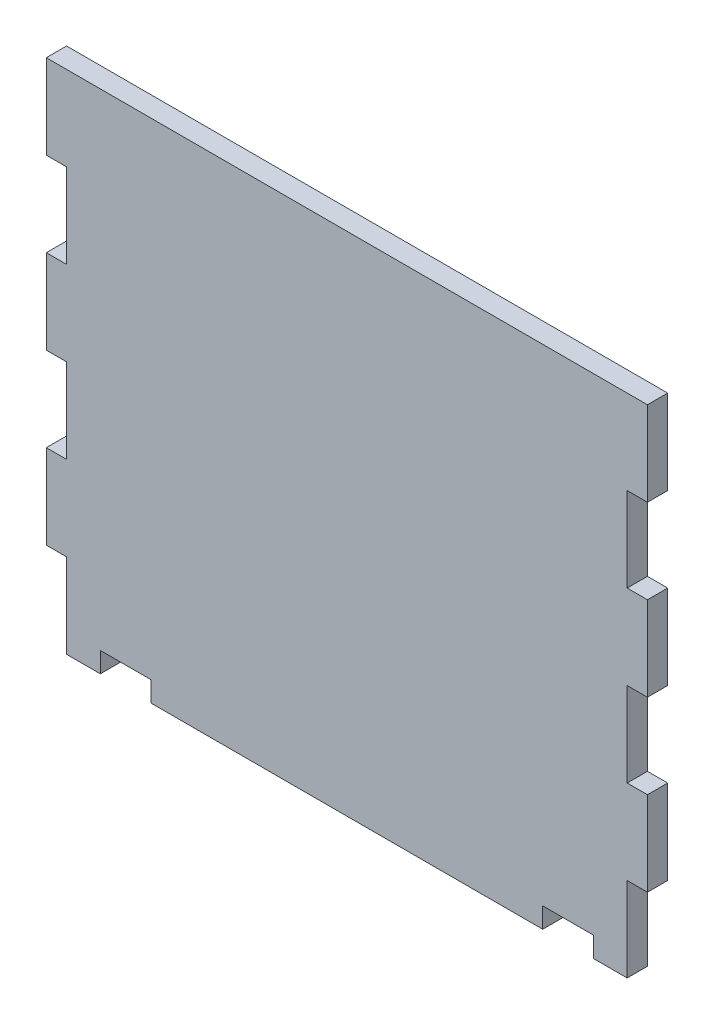
ISO-10303-21;
HEADER;
FILE_DESCRIPTION(('STEP AP214'),'2;1');
FILE_NAME('part.step','',(''),(''),'','','');
FILE_SCHEMA(('AUTOMOTIVE_DESIGN { 1 0 10303 214 1 1 1 1 }'));
ENDSEC;
DATA;
#1=APPLICATION_CONTEXT('core data for automotive mechanical design processes');
#2=APPLICATION_PROTOCOL_DEFINITION('international standard','automotive_design',2000,#1);
#3=PRODUCT_CONTEXT('',#1,'mechanical');
#4=PRODUCT('Part','Part','',(#3));
#5=PRODUCT_RELATED_PRODUCT_CATEGORY('part','',(#4));
#6=PRODUCT_DEFINITION_FORMATION('','',#4);
#7=PRODUCT_DEFINITION_CONTEXT('part definition',#1,'design');
#8=PRODUCT_DEFINITION('design','',#6,#7);
#9=PRODUCT_DEFINITION_SHAPE('','',#8);
#10=(LENGTH_UNIT() NAMED_UNIT(*) SI_UNIT(.MILLI.,.METRE.));
#11=(NAMED_UNIT(*) PLANE_ANGLE_UNIT() SI_UNIT($,.RADIAN.));
#12=(NAMED_UNIT(*) SI_UNIT($,.STERADIAN.) SOLID_ANGLE_UNIT());
#13=UNCERTAINTY_MEASURE_WITH_UNIT(LENGTH_MEASURE(1.E-05),#10,'distance_accuracy_value','');
#14=(GEOMETRIC_REPRESENTATION_CONTEXT(3) GLOBAL_UNCERTAINTY_ASSIGNED_CONTEXT((#13)) GLOBAL_UNIT_ASSIGNED_CONTEXT((#10,
#11,#12)) REPRESENTATION_CONTEXT('',''));
#15=CARTESIAN_POINT('',(0.,0.,0.));
#16=DIRECTION('',(0.,0.,1.));
#17=DIRECTION('',(1.,0.,0.));
#18=AXIS2_PLACEMENT_3D('',#15,#16,#17);
#19=CARTESIAN_POINT('',(0.,0.,6.));
#20=DIRECTION('',(0.,1.,0.));
#21=DIRECTION('',(-1.,0.,0.));
#22=AXIS2_PLACEMENT_3D('',#19,#20,#21);
#23=PLANE('',#22);
#24=DIRECTION('',(1.,0.,0.));
#25=VECTOR('',#24,1.);
#26=CARTESIAN_POINT('',(0.,0.,6.));
#27=LINE('',#26,#25);
#28=CARTESIAN_POINT('',(-16.,0.,6.));
#29=VERTEX_POINT('',#28);
#30=CARTESIAN_POINT('',(-6.00000000000001,0.,6.));
#31=VERTEX_POINT('',#30);
#32=EDGE_CURVE('E542',#29,#31,#27,.T.);
#33=ORIENTED_EDGE('',*,*,#32,.F.);
#34=DIRECTION('',(0.,0.,1.));
#35=VECTOR('',#34,1.);
#36=CARTESIAN_POINT('',(-16.,0.,0.));
#37=LINE('',#36,#35);
#38=CARTESIAN_POINT('',(-16.,0.,0.));
#39=VERTEX_POINT('',#38);
#40=EDGE_CURVE('E291',#39,#29,#37,.T.);
#41=ORIENTED_EDGE('',*,*,#40,.F.);
#42=DIRECTION('',(1.,0.,0.));
#43=VECTOR('',#42,1.);
#44=CARTESIAN_POINT('',(0.,0.,0.));
#45=LINE('',#44,#43);
#46=CARTESIAN_POINT('',(-6.00000000000001,0.,0.));
#47=VERTEX_POINT('',#46);
#48=EDGE_CURVE('E276',#39,#47,#45,.T.);
#49=ORIENTED_EDGE('',*,*,#48,.T.);
#50=DIRECTION('',(0.,0.,1.));
#51=VECTOR('',#50,1.);
#52=CARTESIAN_POINT('',(-6.00000000000001,0.,0.));
#53=LINE('',#52,#51);
#54=EDGE_CURVE('E477',#47,#31,#53,.T.);
#55=ORIENTED_EDGE('',*,*,#54,.T.);
#56=EDGE_LOOP('',(#33,#41,#49,#55));
#57=FACE_BOUND('',#56,.T.);
#58=ADVANCED_FACE('F44',(#57),#23,.F.);
#59=CARTESIAN_POINT('',(-172.,0.,0.));
#60=VERTEX_POINT('',#59);
#61=CARTESIAN_POINT('',(-162.,0.,0.));
#62=VERTEX_POINT('',#61);
#63=EDGE_CURVE('E532',#60,#62,#45,.T.);
#64=ORIENTED_EDGE('',*,*,#63,.T.);
#65=DIRECTION('',(0.,0.,1.));
#66=VECTOR('',#65,1.);
#67=CARTESIAN_POINT('',(-162.,0.,0.));
#68=LINE('',#67,#66);
#69=CARTESIAN_POINT('',(-162.,0.,6.));
#70=VERTEX_POINT('',#69);
#71=EDGE_CURVE('E311',#62,#70,#68,.T.);
#72=ORIENTED_EDGE('',*,*,#71,.T.);
#73=CARTESIAN_POINT('',(-172.,0.,6.));
#74=VERTEX_POINT('',#73);
#75=EDGE_CURVE('E544',#74,#70,#27,.T.);
#76=ORIENTED_EDGE('',*,*,#75,.F.);
#77=DIRECTION('',(0.,0.,1.));
#78=VECTOR('',#77,1.);
#79=CARTESIAN_POINT('',(-172.,0.,0.));
#80=LINE('',#79,#78);
#81=EDGE_CURVE('E453',#60,#74,#80,.T.);
#82=ORIENTED_EDGE('',*,*,#81,.F.);
#83=EDGE_LOOP('',(#64,#72,#76,#82));
#84=FACE_BOUND('',#83,.T.);
#85=ADVANCED_FACE('F644',(#84),#23,.F.);
#86=CARTESIAN_POINT('',(0.,0.,6.));
#87=DIRECTION('',(-1.,0.,0.));
#88=DIRECTION('',(0.,0.,1.));
#89=AXIS2_PLACEMENT_3D('',#86,#87,#88);
#90=PLANE('',#89);
#91=DIRECTION('',(0.,1.,0.));
#92=VECTOR('',#91,1.);
#93=CARTESIAN_POINT('',(0.,0.,6.));
#94=LINE('',#93,#92);
#95=CARTESIAN_POINT('',(0.,125.,6.));
#96=VERTEX_POINT('',#95);
#97=CARTESIAN_POINT('',(0.,150.,6.));
#98=VERTEX_POINT('',#97);
#99=EDGE_CURVE('E528',#96,#98,#94,.T.);
#100=ORIENTED_EDGE('',*,*,#99,.F.);
#101=DIRECTION('',(0.,0.,1.));
#102=VECTOR('',#101,1.);
#103=CARTESIAN_POINT('',(0.,125.,0.));
#104=LINE('',#103,#102);
#105=CARTESIAN_POINT('',(0.,125.,0.));
#106=VERTEX_POINT('',#105);
#107=EDGE_CURVE('E363',#106,#96,#104,.T.);
#108=ORIENTED_EDGE('',*,*,#107,.F.);
#109=DIRECTION('',(0.,1.,0.));
#110=VECTOR('',#109,1.);
#111=CARTESIAN_POINT('',(0.,0.,0.));
#112=LINE('',#111,#110);
#113=CARTESIAN_POINT('',(0.,150.,0.));
#114=VERTEX_POINT('',#113);
#115=EDGE_CURVE('E519',#106,#114,#112,.T.);
#116=ORIENTED_EDGE('',*,*,#115,.T.);
#117=DIRECTION('',(0.,0.,-1.));
#118=VECTOR('',#117,1.);
#119=CARTESIAN_POINT('',(0.,150.,6.));
#120=LINE('',#119,#118);
#121=EDGE_CURVE('E11',#98,#114,#120,.T.);
#122=ORIENTED_EDGE('',*,*,#121,.F.);
#123=EDGE_LOOP('',(#100,#108,#116,#122));
#124=FACE_BOUND('',#123,.T.);
#125=ADVANCED_FACE('F588',(#124),#90,.F.);
#126=CARTESIAN_POINT('',(0.,75.,0.));
#127=VERTEX_POINT('',#126);
#128=CARTESIAN_POINT('',(0.,100.,0.));
#129=VERTEX_POINT('',#128);
#130=EDGE_CURVE('E551',#127,#129,#112,.T.);
#131=ORIENTED_EDGE('',*,*,#130,.T.);
#132=DIRECTION('',(0.,0.,1.));
#133=VECTOR('',#132,1.);
#134=CARTESIAN_POINT('',(0.,100.,0.));
#135=LINE('',#134,#133);
#136=CARTESIAN_POINT('',(0.,100.,6.));
#137=VERTEX_POINT('',#136);
#138=EDGE_CURVE('E366',#129,#137,#135,.T.);
#139=ORIENTED_EDGE('',*,*,#138,.T.);
#140=CARTESIAN_POINT('',(0.,75.,6.));
#141=VERTEX_POINT('',#140);
#142=EDGE_CURVE('E531',#141,#137,#94,.T.);
#143=ORIENTED_EDGE('',*,*,#142,.F.);
#144=DIRECTION('',(0.,0.,1.));
#145=VECTOR('',#144,1.);
#146=CARTESIAN_POINT('',(0.,75.,0.));
#147=LINE('',#146,#145);
#148=EDGE_CURVE('E435',#127,#141,#147,.T.);
#149=ORIENTED_EDGE('',*,*,#148,.F.);
#150=EDGE_LOOP('',(#131,#139,#143,#149));
#151=FACE_BOUND('',#150,.T.);
#152=ADVANCED_FACE('F604',(#151),#90,.F.);
#153=CARTESIAN_POINT('',(-178.,0.,6.));
#154=DIRECTION('',(1.,0.,0.));
#155=DIRECTION('',(0.,0.,-1.));
#156=AXIS2_PLACEMENT_3D('',#153,#154,#155);
#157=PLANE('',#156);
#158=DIRECTION('',(0.,-1.,0.));
#159=VECTOR('',#158,1.);
#160=CARTESIAN_POINT('',(-178.,0.,0.));
#161=LINE('',#160,#159);
#162=CARTESIAN_POINT('',(-178.,100.,0.));
#163=VERTEX_POINT('',#162);
#164=CARTESIAN_POINT('',(-178.,75.,0.));
#165=VERTEX_POINT('',#164);
#166=EDGE_CURVE('E561',#163,#165,#161,.T.);
#167=ORIENTED_EDGE('',*,*,#166,.T.);
#168=DIRECTION('',(0.,0.,1.));
#169=VECTOR('',#168,1.);
#170=CARTESIAN_POINT('',(-178.,75.,0.));
#171=LINE('',#170,#169);
#172=CARTESIAN_POINT('',(-178.,75.,6.));
#173=VERTEX_POINT('',#172);
#174=EDGE_CURVE('E353',#165,#173,#171,.T.);
#175=ORIENTED_EDGE('',*,*,#174,.T.);
#176=DIRECTION('',(0.,-1.,0.));
#177=VECTOR('',#176,1.);
#178=CARTESIAN_POINT('',(-178.,0.,6.));
#179=LINE('',#178,#177);
#180=CARTESIAN_POINT('',(-178.,100.,6.));
#181=VERTEX_POINT('',#180);
#182=EDGE_CURVE('E543',#181,#173,#179,.T.);
#183=ORIENTED_EDGE('',*,*,#182,.F.);
#184=DIRECTION('',(0.,0.,1.));
#185=VECTOR('',#184,1.);
#186=CARTESIAN_POINT('',(-178.,100.,0.));
#187=LINE('',#186,#185);
#188=EDGE_CURVE('E505',#163,#181,#187,.T.);
#189=ORIENTED_EDGE('',*,*,#188,.F.);
#190=EDGE_LOOP('',(#167,#175,#183,#189));
#191=FACE_BOUND('',#190,.T.);
#192=ADVANCED_FACE('F665',(#191),#157,.F.);
#193=CARTESIAN_POINT('',(-178.,150.,0.));
#194=VERTEX_POINT('',#193);
#195=CARTESIAN_POINT('',(-178.,125.,0.));
#196=VERTEX_POINT('',#195);
#197=EDGE_CURVE('E557',#194,#196,#161,.T.);
#198=ORIENTED_EDGE('',*,*,#197,.T.);
#199=DIRECTION('',(0.,0.,1.));
#200=VECTOR('',#199,1.);
#201=CARTESIAN_POINT('',(-178.,125.,0.));
#202=LINE('',#201,#200);
#203=CARTESIAN_POINT('',(-178.,125.,6.));
#204=VERTEX_POINT('',#203);
#205=EDGE_CURVE('E515',#196,#204,#202,.T.);
#206=ORIENTED_EDGE('',*,*,#205,.T.);
#207=CARTESIAN_POINT('',(-178.,150.,6.));
#208=VERTEX_POINT('',#207);
#209=EDGE_CURVE('E538',#208,#204,#179,.T.);
#210=ORIENTED_EDGE('',*,*,#209,.F.);
#211=DIRECTION('',(0.,0.,-1.));
#212=VECTOR('',#211,1.);
#213=CARTESIAN_POINT('',(-178.,150.,6.));
#214=LINE('',#213,#212);
#215=EDGE_CURVE('E53',#208,#194,#214,.T.);
#216=ORIENTED_EDGE('',*,*,#215,.T.);
#217=EDGE_LOOP('',(#198,#206,#210,#216));
#218=FACE_BOUND('',#217,.T.);
#219=ADVANCED_FACE('F571',(#218),#157,.F.);
#220=CARTESIAN_POINT('',(0.,25.,0.));
#221=VERTEX_POINT('',#220);
#222=CARTESIAN_POINT('',(0.,50.,0.));
#223=VERTEX_POINT('',#222);
#224=EDGE_CURVE('E552',#221,#223,#112,.T.);
#225=ORIENTED_EDGE('',*,*,#224,.T.);
#226=DIRECTION('',(0.,0.,1.));
#227=VECTOR('',#226,1.);
#228=CARTESIAN_POINT('',(0.,50.,0.));
#229=LINE('',#228,#227);
#230=CARTESIAN_POINT('',(0.,50.,6.));
#231=VERTEX_POINT('',#230);
#232=EDGE_CURVE('E438',#223,#231,#229,.T.);
#233=ORIENTED_EDGE('',*,*,#232,.T.);
#234=CARTESIAN_POINT('',(0.,25.,6.));
#235=VERTEX_POINT('',#234);
#236=EDGE_CURVE('E533',#235,#231,#94,.T.);
#237=ORIENTED_EDGE('',*,*,#236,.F.);
#238=DIRECTION('',(0.,0.,1.));
#239=VECTOR('',#238,1.);
#240=CARTESIAN_POINT('',(0.,25.,0.));
#241=LINE('',#240,#239);
#242=EDGE_CURVE('E486',#221,#235,#241,.T.);
#243=ORIENTED_EDGE('',*,*,#242,.F.);
#244=EDGE_LOOP('',(#225,#233,#237,#243));
#245=FACE_BOUND('',#244,.T.);
#246=ADVANCED_FACE('F46',(#245),#90,.F.);
#247=CARTESIAN_POINT('',(0.,150.,6.));
#248=DIRECTION('',(0.,-1.,0.));
#249=DIRECTION('',(0.,0.,-1.));
#250=AXIS2_PLACEMENT_3D('',#247,#248,#249);
#251=PLANE('',#250);
#252=DIRECTION('',(-1.,0.,0.));
#253=VECTOR('',#252,1.);
#254=CARTESIAN_POINT('',(0.,150.,0.));
#255=LINE('',#254,#253);
#256=EDGE_CURVE('E553',#114,#194,#255,.T.);
#257=ORIENTED_EDGE('',*,*,#256,.T.);
#258=ORIENTED_EDGE('',*,*,#215,.F.);
#259=DIRECTION('',(-1.,0.,0.));
#260=VECTOR('',#259,1.);
#261=CARTESIAN_POINT('',(0.,150.,6.));
#262=LINE('',#261,#260);
#263=EDGE_CURVE('E534',#98,#208,#262,.T.);
#264=ORIENTED_EDGE('',*,*,#263,.F.);
#265=ORIENTED_EDGE('',*,*,#121,.T.);
#266=EDGE_LOOP('',(#257,#258,#264,#265));
#267=FACE_BOUND('',#266,.T.);
#268=ADVANCED_FACE('F586',(#267),#251,.F.);
#269=CARTESIAN_POINT('',(-178.,50.,6.));
#270=VERTEX_POINT('',#269);
#271=CARTESIAN_POINT('',(-178.,25.,6.));
#272=VERTEX_POINT('',#271);
#273=EDGE_CURVE('E537',#270,#272,#179,.T.);
#274=ORIENTED_EDGE('',*,*,#273,.F.);
#275=DIRECTION('',(0.,0.,1.));
#276=VECTOR('',#275,1.);
#277=CARTESIAN_POINT('',(-178.,50.,0.));
#278=LINE('',#277,#276);
#279=CARTESIAN_POINT('',(-178.,50.,0.));
#280=VERTEX_POINT('',#279);
#281=EDGE_CURVE('E385',#280,#270,#278,.T.);
#282=ORIENTED_EDGE('',*,*,#281,.F.);
#283=CARTESIAN_POINT('',(-178.,25.,0.));
#284=VERTEX_POINT('',#283);
#285=EDGE_CURVE('E556',#280,#284,#161,.T.);
#286=ORIENTED_EDGE('',*,*,#285,.T.);
#287=DIRECTION('',(0.,0.,1.));
#288=VECTOR('',#287,1.);
#289=CARTESIAN_POINT('',(-178.,25.,0.));
#290=LINE('',#289,#288);
#291=EDGE_CURVE('E427',#284,#272,#290,.T.);
#292=ORIENTED_EDGE('',*,*,#291,.T.);
#293=EDGE_LOOP('',(#274,#282,#286,#292));
#294=FACE_BOUND('',#293,.T.);
#295=ADVANCED_FACE('F657',(#294),#157,.F.);
#296=CARTESIAN_POINT('',(-147.,0.,0.));
#297=VERTEX_POINT('',#296);
#298=CARTESIAN_POINT('',(-31.,0.,0.));
#299=VERTEX_POINT('',#298);
#300=EDGE_CURVE('E564',#297,#299,#45,.T.);
#301=ORIENTED_EDGE('',*,*,#300,.T.);
#302=DIRECTION('',(0.,0.,1.));
#303=VECTOR('',#302,1.);
#304=CARTESIAN_POINT('',(-31.,0.,0.));
#305=LINE('',#304,#303);
#306=CARTESIAN_POINT('',(-31.,0.,6.));
#307=VERTEX_POINT('',#306);
#308=EDGE_CURVE('E295',#299,#307,#305,.T.);
#309=ORIENTED_EDGE('',*,*,#308,.T.);
#310=CARTESIAN_POINT('',(-147.,0.,6.));
#311=VERTEX_POINT('',#310);
#312=EDGE_CURVE('E548',#311,#307,#27,.T.);
#313=ORIENTED_EDGE('',*,*,#312,.F.);
#314=DIRECTION('',(0.,0.,1.));
#315=VECTOR('',#314,1.);
#316=CARTESIAN_POINT('',(-147.,0.,0.));
#317=LINE('',#316,#315);
#318=EDGE_CURVE('E301',#297,#311,#317,.T.);
#319=ORIENTED_EDGE('',*,*,#318,.F.);
#320=EDGE_LOOP('',(#301,#309,#313,#319));
#321=FACE_BOUND('',#320,.T.);
#322=ADVANCED_FACE('F647',(#321),#23,.F.);
#323=CARTESIAN_POINT('',(0.,0.,6.));
#324=DIRECTION('',(0.,0.,1.));
#325=DIRECTION('',(1.,0.,0.));
#326=AXIS2_PLACEMENT_3D('',#323,#324,#325);
#327=PLANE('',#326);
#328=DIRECTION('',(0.,1.,0.));
#329=VECTOR('',#328,1.);
#330=CARTESIAN_POINT('',(-16.,0.,6.));
#331=LINE('',#330,#329);
#332=CARTESIAN_POINT('',(-16.,6.,6.));
#333=VERTEX_POINT('',#332);
#334=EDGE_CURVE('E260',#29,#333,#331,.T.);
#335=ORIENTED_EDGE('',*,*,#334,.F.);
#336=ORIENTED_EDGE('',*,*,#32,.T.);
#337=DIRECTION('',(0.,-1.,0.));
#338=VECTOR('',#337,1.);
#339=CARTESIAN_POINT('',(-6.00000000000001,25.,6.));
#340=LINE('',#339,#338);
#341=CARTESIAN_POINT('',(-6.00000000000001,25.,6.));
#342=VERTEX_POINT('',#341);
#343=EDGE_CURVE('E294',#342,#31,#340,.T.);
#344=ORIENTED_EDGE('',*,*,#343,.F.);
#345=DIRECTION('',(-1.,0.,0.));
#346=VECTOR('',#345,1.);
#347=CARTESIAN_POINT('',(-6.00000000000001,25.,6.));
#348=LINE('',#347,#346);
#349=EDGE_CURVE('E473',#235,#342,#348,.T.);
#350=ORIENTED_EDGE('',*,*,#349,.F.);
#351=ORIENTED_EDGE('',*,*,#236,.T.);
#352=DIRECTION('',(1.,0.,0.));
#353=VECTOR('',#352,1.);
#354=CARTESIAN_POINT('',(-6.00000000000001,50.,6.));
#355=LINE('',#354,#353);
#356=CARTESIAN_POINT('',(-6.00000000000001,50.,6.));
#357=VERTEX_POINT('',#356);
#358=EDGE_CURVE('E426',#357,#231,#355,.T.);
#359=ORIENTED_EDGE('',*,*,#358,.F.);
#360=DIRECTION('',(0.,-1.,0.));
#361=VECTOR('',#360,1.);
#362=CARTESIAN_POINT('',(-6.00000000000001,75.,6.));
#363=LINE('',#362,#361);
#364=CARTESIAN_POINT('',(-6.00000000000001,75.,6.));
#365=VERTEX_POINT('',#364);
#366=EDGE_CURVE('E422',#365,#357,#363,.T.);
#367=ORIENTED_EDGE('',*,*,#366,.F.);
#368=DIRECTION('',(-1.,0.,0.));
#369=VECTOR('',#368,1.);
#370=CARTESIAN_POINT('',(-6.00000000000001,75.,6.));
#371=LINE('',#370,#369);
#372=EDGE_CURVE('E413',#141,#365,#371,.T.);
#373=ORIENTED_EDGE('',*,*,#372,.F.);
#374=ORIENTED_EDGE('',*,*,#142,.T.);
#375=DIRECTION('',(1.,0.,0.));
#376=VECTOR('',#375,1.);
#377=CARTESIAN_POINT('',(-6.00000000000001,100.,6.));
#378=LINE('',#377,#376);
#379=CARTESIAN_POINT('',(-6.00000000000001,100.,6.));
#380=VERTEX_POINT('',#379);
#381=EDGE_CURVE('E352',#380,#137,#378,.T.);
#382=ORIENTED_EDGE('',*,*,#381,.F.);
#383=DIRECTION('',(0.,-1.,0.));
#384=VECTOR('',#383,1.);
#385=CARTESIAN_POINT('',(-6.00000000000001,125.,6.));
#386=LINE('',#385,#384);
#387=CARTESIAN_POINT('',(-6.00000000000001,125.,6.));
#388=VERTEX_POINT('',#387);
#389=EDGE_CURVE('E348',#388,#380,#386,.T.);
#390=ORIENTED_EDGE('',*,*,#389,.F.);
#391=DIRECTION('',(-1.,0.,0.));
#392=VECTOR('',#391,1.);
#393=CARTESIAN_POINT('',(-6.00000000000001,125.,6.));
#394=LINE('',#393,#392);
#395=EDGE_CURVE('E339',#96,#388,#394,.T.);
#396=ORIENTED_EDGE('',*,*,#395,.F.);
#397=ORIENTED_EDGE('',*,*,#99,.T.);
#398=ORIENTED_EDGE('',*,*,#263,.T.);
#399=ORIENTED_EDGE('',*,*,#209,.T.);
#400=DIRECTION('',(-1.,0.,0.));
#401=VECTOR('',#400,1.);
#402=CARTESIAN_POINT('',(-178.,125.,6.));
#403=LINE('',#402,#401);
#404=CARTESIAN_POINT('',(-172.,125.,6.));
#405=VERTEX_POINT('',#404);
#406=EDGE_CURVE('E497',#405,#204,#403,.T.);
#407=ORIENTED_EDGE('',*,*,#406,.F.);
#408=DIRECTION('',(0.,1.,0.));
#409=VECTOR('',#408,1.);
#410=CARTESIAN_POINT('',(-172.,125.,6.));
#411=LINE('',#410,#409);
#412=CARTESIAN_POINT('',(-172.,100.,6.));
#413=VERTEX_POINT('',#412);
#414=EDGE_CURVE('E509',#413,#405,#411,.T.);
#415=ORIENTED_EDGE('',*,*,#414,.F.);
#416=DIRECTION('',(1.,0.,0.));
#417=VECTOR('',#416,1.);
#418=CARTESIAN_POINT('',(-178.,100.,6.));
#419=LINE('',#418,#417);
#420=EDGE_CURVE('E362',#181,#413,#419,.T.);
#421=ORIENTED_EDGE('',*,*,#420,.F.);
#422=ORIENTED_EDGE('',*,*,#182,.T.);
#423=DIRECTION('',(-1.,0.,0.));
#424=VECTOR('',#423,1.);
#425=CARTESIAN_POINT('',(-178.,75.,6.));
#426=LINE('',#425,#424);
#427=CARTESIAN_POINT('',(-172.,75.,6.));
#428=VERTEX_POINT('',#427);
#429=EDGE_CURVE('E377',#428,#173,#426,.T.);
#430=ORIENTED_EDGE('',*,*,#429,.F.);
#431=DIRECTION('',(0.,1.,0.));
#432=VECTOR('',#431,1.);
#433=CARTESIAN_POINT('',(-172.,75.,6.));
#434=LINE('',#433,#432);
#435=CARTESIAN_POINT('',(-172.,50.,6.));
#436=VERTEX_POINT('',#435);
#437=EDGE_CURVE('E390',#436,#428,#434,.T.);
#438=ORIENTED_EDGE('',*,*,#437,.F.);
#439=DIRECTION('',(1.,0.,0.));
#440=VECTOR('',#439,1.);
#441=CARTESIAN_POINT('',(-178.,50.,6.));
#442=LINE('',#441,#440);
#443=EDGE_CURVE('E386',#270,#436,#442,.T.);
#444=ORIENTED_EDGE('',*,*,#443,.F.);
#445=ORIENTED_EDGE('',*,*,#273,.T.);
#446=DIRECTION('',(-1.,0.,0.));
#447=VECTOR('',#446,1.);
#448=CARTESIAN_POINT('',(-178.,25.,6.));
#449=LINE('',#448,#447);
#450=CARTESIAN_POINT('',(-172.,25.,6.));
#451=VERTEX_POINT('',#450);
#452=EDGE_CURVE('E449',#451,#272,#449,.T.);
#453=ORIENTED_EDGE('',*,*,#452,.F.);
#454=DIRECTION('',(0.,1.,0.));
#455=VECTOR('',#454,1.);
#456=CARTESIAN_POINT('',(-172.,25.,6.));
#457=LINE('',#456,#455);
#458=EDGE_CURVE('E454',#74,#451,#457,.T.);
#459=ORIENTED_EDGE('',*,*,#458,.F.);
#460=ORIENTED_EDGE('',*,*,#75,.T.);
#461=DIRECTION('',(0.,-1.,0.));
#462=VECTOR('',#461,1.);
#463=CARTESIAN_POINT('',(-162.,0.,6.));
#464=LINE('',#463,#462);
#465=CARTESIAN_POINT('',(-162.,6.,6.));
#466=VERTEX_POINT('',#465);
#467=EDGE_CURVE('E315',#466,#70,#464,.T.);
#468=ORIENTED_EDGE('',*,*,#467,.F.);
#469=DIRECTION('',(-1.,0.,0.));
#470=VECTOR('',#469,1.);
#471=CARTESIAN_POINT('',(-162.,6.,6.));
#472=LINE('',#471,#470);
#473=CARTESIAN_POINT('',(-147.,5.99999999999998,6.));
#474=VERTEX_POINT('',#473);
#475=EDGE_CURVE('E318',#474,#466,#472,.T.);
#476=ORIENTED_EDGE('',*,*,#475,.F.);
#477=DIRECTION('',(0.,1.,0.));
#478=VECTOR('',#477,1.);
#479=CARTESIAN_POINT('',(-147.,0.,6.));
#480=LINE('',#479,#478);
#481=EDGE_CURVE('E288',#311,#474,#480,.T.);
#482=ORIENTED_EDGE('',*,*,#481,.F.);
#483=ORIENTED_EDGE('',*,*,#312,.T.);
#484=DIRECTION('',(0.,-1.,0.));
#485=VECTOR('',#484,1.);
#486=CARTESIAN_POINT('',(-31.,0.,6.));
#487=LINE('',#486,#485);
#488=CARTESIAN_POINT('',(-31.,6.,6.));
#489=VERTEX_POINT('',#488);
#490=EDGE_CURVE('E278',#489,#307,#487,.T.);
#491=ORIENTED_EDGE('',*,*,#490,.F.);
#492=DIRECTION('',(-1.,0.,0.));
#493=VECTOR('',#492,1.);
#494=CARTESIAN_POINT('',(-16.,6.,6.));
#495=LINE('',#494,#493);
#496=EDGE_CURVE('E281',#333,#489,#495,.T.);
#497=ORIENTED_EDGE('',*,*,#496,.F.);
#498=EDGE_LOOP('',(#335,#336,#344,#350,#351,#359,#367,#373,#374,#382,#390,#396,#397,#398,#399,
#407,#415,#421,#422,#430,#438,#444,#445,#453,#459,#460,#468,#476,#482,#483,#491,#497));
#499=FACE_BOUND('',#498,.T.);
#500=ADVANCED_FACE('F581',(#499),#327,.T.);
#501=CARTESIAN_POINT('',(0.,0.,0.));
#502=DIRECTION('',(0.,0.,1.));
#503=DIRECTION('',(1.,0.,0.));
#504=AXIS2_PLACEMENT_3D('',#501,#502,#503);
#505=PLANE('',#504);
#506=ORIENTED_EDGE('',*,*,#48,.F.);
#507=DIRECTION('',(0.,1.,0.));
#508=VECTOR('',#507,1.);
#509=CARTESIAN_POINT('',(-16.,0.,0.));
#510=LINE('',#509,#508);
#511=CARTESIAN_POINT('',(-16.,6.,0.));
#512=VERTEX_POINT('',#511);
#513=EDGE_CURVE('E257',#39,#512,#510,.T.);
#514=ORIENTED_EDGE('',*,*,#513,.T.);
#515=DIRECTION('',(-1.,0.,0.));
#516=VECTOR('',#515,1.);
#517=CARTESIAN_POINT('',(-16.,6.,0.));
#518=LINE('',#517,#516);
#519=CARTESIAN_POINT('',(-31.,6.,0.));
#520=VERTEX_POINT('',#519);
#521=EDGE_CURVE('E268',#512,#520,#518,.T.);
#522=ORIENTED_EDGE('',*,*,#521,.T.);
#523=DIRECTION('',(0.,-1.,0.));
#524=VECTOR('',#523,1.);
#525=CARTESIAN_POINT('',(-31.,0.,0.));
#526=LINE('',#525,#524);
#527=EDGE_CURVE('E60',#520,#299,#526,.T.);
#528=ORIENTED_EDGE('',*,*,#527,.T.);
#529=ORIENTED_EDGE('',*,*,#300,.F.);
#530=DIRECTION('',(0.,1.,0.));
#531=VECTOR('',#530,1.);
#532=CARTESIAN_POINT('',(-147.,0.,0.));
#533=LINE('',#532,#531);
#534=CARTESIAN_POINT('',(-147.,5.99999999999998,0.));
#535=VERTEX_POINT('',#534);
#536=EDGE_CURVE('E319',#297,#535,#533,.T.);
#537=ORIENTED_EDGE('',*,*,#536,.T.);
#538=DIRECTION('',(-1.,0.,0.));
#539=VECTOR('',#538,1.);
#540=CARTESIAN_POINT('',(-162.,6.,0.));
#541=LINE('',#540,#539);
#542=CARTESIAN_POINT('',(-162.,6.,0.));
#543=VERTEX_POINT('',#542);
#544=EDGE_CURVE('E68',#535,#543,#541,.T.);
#545=ORIENTED_EDGE('',*,*,#544,.T.);
#546=DIRECTION('',(0.,-1.,0.));
#547=VECTOR('',#546,1.);
#548=CARTESIAN_POINT('',(-162.,0.,0.));
#549=LINE('',#548,#547);
#550=EDGE_CURVE('E304',#543,#62,#549,.T.);
#551=ORIENTED_EDGE('',*,*,#550,.T.);
#552=ORIENTED_EDGE('',*,*,#63,.F.);
#553=DIRECTION('',(0.,1.,0.));
#554=VECTOR('',#553,1.);
#555=CARTESIAN_POINT('',(-172.,25.,0.));
#556=LINE('',#555,#554);
#557=CARTESIAN_POINT('',(-172.,25.,0.));
#558=VERTEX_POINT('',#557);
#559=EDGE_CURVE('E444',#60,#558,#556,.T.);
#560=ORIENTED_EDGE('',*,*,#559,.T.);
#561=DIRECTION('',(-1.,0.,0.));
#562=VECTOR('',#561,1.);
#563=CARTESIAN_POINT('',(-178.,25.,0.));
#564=LINE('',#563,#562);
#565=EDGE_CURVE('E448',#558,#284,#564,.T.);
#566=ORIENTED_EDGE('',*,*,#565,.T.);
#567=ORIENTED_EDGE('',*,*,#285,.F.);
#568=DIRECTION('',(1.,0.,0.));
#569=VECTOR('',#568,1.);
#570=CARTESIAN_POINT('',(-178.,50.,0.));
#571=LINE('',#570,#569);
#572=CARTESIAN_POINT('',(-172.,50.,0.));
#573=VERTEX_POINT('',#572);
#574=EDGE_CURVE('E372',#280,#573,#571,.T.);
#575=ORIENTED_EDGE('',*,*,#574,.T.);
#576=DIRECTION('',(0.,1.,0.));
#577=VECTOR('',#576,1.);
#578=CARTESIAN_POINT('',(-172.,75.,0.));
#579=LINE('',#578,#577);
#580=CARTESIAN_POINT('',(-172.,75.,0.));
#581=VERTEX_POINT('',#580);
#582=EDGE_CURVE('E376',#573,#581,#579,.T.);
#583=ORIENTED_EDGE('',*,*,#582,.T.);
#584=DIRECTION('',(-1.,0.,0.));
#585=VECTOR('',#584,1.);
#586=CARTESIAN_POINT('',(-178.,75.,0.));
#587=LINE('',#586,#585);
#588=EDGE_CURVE('E381',#581,#165,#587,.T.);
#589=ORIENTED_EDGE('',*,*,#588,.T.);
#590=ORIENTED_EDGE('',*,*,#166,.F.);
#591=DIRECTION('',(1.,0.,0.));
#592=VECTOR('',#591,1.);
#593=CARTESIAN_POINT('',(-178.,100.,0.));
#594=LINE('',#593,#592);
#595=CARTESIAN_POINT('',(-172.,100.,0.));
#596=VERTEX_POINT('',#595);
#597=EDGE_CURVE('E492',#163,#596,#594,.T.);
#598=ORIENTED_EDGE('',*,*,#597,.T.);
#599=DIRECTION('',(0.,1.,0.));
#600=VECTOR('',#599,1.);
#601=CARTESIAN_POINT('',(-172.,125.,0.));
#602=LINE('',#601,#600);
#603=CARTESIAN_POINT('',(-172.,125.,0.));
#604=VERTEX_POINT('',#603);
#605=EDGE_CURVE('E496',#596,#604,#602,.T.);
#606=ORIENTED_EDGE('',*,*,#605,.T.);
#607=DIRECTION('',(-1.,0.,0.));
#608=VECTOR('',#607,1.);
#609=CARTESIAN_POINT('',(-178.,125.,0.));
#610=LINE('',#609,#608);
#611=EDGE_CURVE('E501',#604,#196,#610,.T.);
#612=ORIENTED_EDGE('',*,*,#611,.T.);
#613=ORIENTED_EDGE('',*,*,#197,.F.);
#614=ORIENTED_EDGE('',*,*,#256,.F.);
#615=ORIENTED_EDGE('',*,*,#115,.F.);
#616=DIRECTION('',(-1.,0.,0.));
#617=VECTOR('',#616,1.);
#618=CARTESIAN_POINT('',(-6.00000000000001,125.,0.));
#619=LINE('',#618,#617);
#620=CARTESIAN_POINT('',(-6.00000000000001,125.,0.));
#621=VERTEX_POINT('',#620);
#622=EDGE_CURVE('E343',#106,#621,#619,.T.);
#623=ORIENTED_EDGE('',*,*,#622,.T.);
#624=DIRECTION('',(0.,-1.,0.));
#625=VECTOR('',#624,1.);
#626=CARTESIAN_POINT('',(-6.00000000000001,125.,0.));
#627=LINE('',#626,#625);
#628=CARTESIAN_POINT('',(-6.00000000000001,100.,0.));
#629=VERTEX_POINT('',#628);
#630=EDGE_CURVE('E334',#621,#629,#627,.T.);
#631=ORIENTED_EDGE('',*,*,#630,.T.);
#632=DIRECTION('',(1.,0.,0.));
#633=VECTOR('',#632,1.);
#634=CARTESIAN_POINT('',(-6.00000000000001,100.,0.));
#635=LINE('',#634,#633);
#636=EDGE_CURVE('E338',#629,#129,#635,.T.);
#637=ORIENTED_EDGE('',*,*,#636,.T.);
#638=ORIENTED_EDGE('',*,*,#130,.F.);
#639=DIRECTION('',(-1.,0.,0.));
#640=VECTOR('',#639,1.);
#641=CARTESIAN_POINT('',(-6.00000000000001,75.,0.));
#642=LINE('',#641,#640);
#643=CARTESIAN_POINT('',(-6.00000000000001,75.,0.));
#644=VERTEX_POINT('',#643);
#645=EDGE_CURVE('E417',#127,#644,#642,.T.);
#646=ORIENTED_EDGE('',*,*,#645,.T.);
#647=DIRECTION('',(0.,-1.,0.));
#648=VECTOR('',#647,1.);
#649=CARTESIAN_POINT('',(-6.00000000000001,75.,0.));
#650=LINE('',#649,#648);
#651=CARTESIAN_POINT('',(-6.00000000000001,50.,0.));
#652=VERTEX_POINT('',#651);
#653=EDGE_CURVE('E408',#644,#652,#650,.T.);
#654=ORIENTED_EDGE('',*,*,#653,.T.);
#655=DIRECTION('',(1.,0.,0.));
#656=VECTOR('',#655,1.);
#657=CARTESIAN_POINT('',(-6.00000000000001,50.,0.));
#658=LINE('',#657,#656);
#659=EDGE_CURVE('E412',#652,#223,#658,.T.);
#660=ORIENTED_EDGE('',*,*,#659,.T.);
#661=ORIENTED_EDGE('',*,*,#224,.F.);
#662=DIRECTION('',(-1.,0.,0.));
#663=VECTOR('',#662,1.);
#664=CARTESIAN_POINT('',(-6.00000000000001,25.,0.));
#665=LINE('',#664,#663);
#666=CARTESIAN_POINT('',(-6.00000000000001,25.,0.));
#667=VERTEX_POINT('',#666);
#668=EDGE_CURVE('E472',#221,#667,#665,.T.);
#669=ORIENTED_EDGE('',*,*,#668,.T.);
#670=DIRECTION('',(0.,-1.,0.));
#671=VECTOR('',#670,1.);
#672=CARTESIAN_POINT('',(-6.00000000000001,25.,0.));
#673=LINE('',#672,#671);
#674=EDGE_CURVE('E469',#667,#47,#673,.T.);
#675=ORIENTED_EDGE('',*,*,#674,.T.);
#676=EDGE_LOOP('',(#506,#514,#522,#528,#529,#537,#545,#551,#552,#560,#566,#567,#575,#583,#589,
#590,#598,#606,#612,#613,#614,#615,#623,#631,#637,#638,#646,#654,#660,#661,#669,#675));
#677=FACE_BOUND('',#676,.T.);
#678=ADVANCED_FACE('F274',(#677),#505,.F.);
#679=CARTESIAN_POINT('',(-178.,125.,0.));
#680=DIRECTION('',(0.,1.,0.));
#681=DIRECTION('',(0.,0.,1.));
#682=AXIS2_PLACEMENT_3D('',#679,#680,#681);
#683=PLANE('',#682);
#684=ORIENTED_EDGE('',*,*,#406,.T.);
#685=ORIENTED_EDGE('',*,*,#205,.F.);
#686=ORIENTED_EDGE('',*,*,#611,.F.);
#687=DIRECTION('',(0.,0.,1.));
#688=VECTOR('',#687,1.);
#689=CARTESIAN_POINT('',(-172.,125.,0.));
#690=LINE('',#689,#688);
#691=EDGE_CURVE('E520',#604,#405,#690,.T.);
#692=ORIENTED_EDGE('',*,*,#691,.T.);
#693=EDGE_LOOP('',(#684,#685,#686,#692));
#694=FACE_BOUND('',#693,.T.);
#695=ADVANCED_FACE('F578',(#694),#683,.F.);
#696=CARTESIAN_POINT('',(-172.,125.,0.));
#697=DIRECTION('',(1.,0.,0.));
#698=DIRECTION('',(0.,0.,-1.));
#699=AXIS2_PLACEMENT_3D('',#696,#697,#698);
#700=PLANE('',#699);
#701=ORIENTED_EDGE('',*,*,#414,.T.);
#702=ORIENTED_EDGE('',*,*,#691,.F.);
#703=ORIENTED_EDGE('',*,*,#605,.F.);
#704=DIRECTION('',(0.,0.,1.));
#705=VECTOR('',#704,1.);
#706=CARTESIAN_POINT('',(-172.,100.,0.));
#707=LINE('',#706,#705);
#708=EDGE_CURVE('E523',#596,#413,#707,.T.);
#709=ORIENTED_EDGE('',*,*,#708,.T.);
#710=EDGE_LOOP('',(#701,#702,#703,#709));
#711=FACE_BOUND('',#710,.T.);
#712=ADVANCED_FACE('F720',(#711),#700,.F.);
#713=CARTESIAN_POINT('',(-178.,100.,0.));
#714=DIRECTION('',(0.,-1.,0.));
#715=DIRECTION('',(0.,0.,-1.));
#716=AXIS2_PLACEMENT_3D('',#713,#714,#715);
#717=PLANE('',#716);
#718=ORIENTED_EDGE('',*,*,#420,.T.);
#719=ORIENTED_EDGE('',*,*,#708,.F.);
#720=ORIENTED_EDGE('',*,*,#597,.F.);
#721=ORIENTED_EDGE('',*,*,#188,.T.);
#722=EDGE_LOOP('',(#718,#719,#720,#721));
#723=FACE_BOUND('',#722,.T.);
#724=ADVANCED_FACE('F718',(#723),#717,.F.);
#725=CARTESIAN_POINT('',(-6.00000000000001,25.,0.));
#726=DIRECTION('',(-1.,0.,0.));
#727=DIRECTION('',(0.,0.,1.));
#728=AXIS2_PLACEMENT_3D('',#725,#726,#727);
#729=PLANE('',#728);
#730=ORIENTED_EDGE('',*,*,#343,.T.);
#731=ORIENTED_EDGE('',*,*,#54,.F.);
#732=ORIENTED_EDGE('',*,*,#674,.F.);
#733=DIRECTION('',(0.,0.,1.));
#734=VECTOR('',#733,1.);
#735=CARTESIAN_POINT('',(-6.00000000000001,25.,0.));
#736=LINE('',#735,#734);
#737=EDGE_CURVE('E458',#667,#342,#736,.T.);
#738=ORIENTED_EDGE('',*,*,#737,.T.);
#739=EDGE_LOOP('',(#730,#731,#732,#738));
#740=FACE_BOUND('',#739,.T.);
#741=ADVANCED_FACE('F675',(#740),#729,.F.);
#742=CARTESIAN_POINT('',(-6.00000000000001,25.,0.));
#743=DIRECTION('',(0.,1.,0.));
#744=DIRECTION('',(0.,0.,1.));
#745=AXIS2_PLACEMENT_3D('',#742,#743,#744);
#746=PLANE('',#745);
#747=ORIENTED_EDGE('',*,*,#349,.T.);
#748=ORIENTED_EDGE('',*,*,#737,.F.);
#749=ORIENTED_EDGE('',*,*,#668,.F.);
#750=ORIENTED_EDGE('',*,*,#242,.T.);
#751=EDGE_LOOP('',(#747,#748,#749,#750));
#752=FACE_BOUND('',#751,.T.);
#753=ADVANCED_FACE('F892',(#752),#746,.F.);
#754=CARTESIAN_POINT('',(-178.,25.,0.));
#755=DIRECTION('',(0.,1.,0.));
#756=DIRECTION('',(0.,0.,1.));
#757=AXIS2_PLACEMENT_3D('',#754,#755,#756);
#758=PLANE('',#757);
#759=ORIENTED_EDGE('',*,*,#452,.T.);
#760=ORIENTED_EDGE('',*,*,#291,.F.);
#761=ORIENTED_EDGE('',*,*,#565,.F.);
#762=DIRECTION('',(0.,0.,1.));
#763=VECTOR('',#762,1.);
#764=CARTESIAN_POINT('',(-172.,25.,0.));
#765=LINE('',#764,#763);
#766=EDGE_CURVE('E464',#558,#451,#765,.T.);
#767=ORIENTED_EDGE('',*,*,#766,.T.);
#768=EDGE_LOOP('',(#759,#760,#761,#767));
#769=FACE_BOUND('',#768,.T.);
#770=ADVANCED_FACE('F638',(#769),#758,.F.);
#771=CARTESIAN_POINT('',(-172.,25.,0.));
#772=DIRECTION('',(1.,0.,0.));
#773=DIRECTION('',(0.,0.,-1.));
#774=AXIS2_PLACEMENT_3D('',#771,#772,#773);
#775=PLANE('',#774);
#776=ORIENTED_EDGE('',*,*,#458,.T.);
#777=ORIENTED_EDGE('',*,*,#766,.F.);
#778=ORIENTED_EDGE('',*,*,#559,.F.);
#779=ORIENTED_EDGE('',*,*,#81,.T.);
#780=EDGE_LOOP('',(#776,#777,#778,#779));
#781=FACE_BOUND('',#780,.T.);
#782=ADVANCED_FACE('F631',(#781),#775,.F.);
#783=CARTESIAN_POINT('',(-6.00000000000001,75.,0.));
#784=DIRECTION('',(-1.,0.,0.));
#785=DIRECTION('',(0.,0.,1.));
#786=AXIS2_PLACEMENT_3D('',#783,#784,#785);
#787=PLANE('',#786);
#788=ORIENTED_EDGE('',*,*,#366,.T.);
#789=DIRECTION('',(0.,0.,1.));
#790=VECTOR('',#789,1.);
#791=CARTESIAN_POINT('',(-6.00000000000001,50.,0.));
#792=LINE('',#791,#790);
#793=EDGE_CURVE('E421',#652,#357,#792,.T.);
#794=ORIENTED_EDGE('',*,*,#793,.F.);
#795=ORIENTED_EDGE('',*,*,#653,.F.);
#796=DIRECTION('',(0.,0.,1.));
#797=VECTOR('',#796,1.);
#798=CARTESIAN_POINT('',(-6.00000000000001,75.,0.));
#799=LINE('',#798,#797);
#800=EDGE_CURVE('E391',#644,#365,#799,.T.);
#801=ORIENTED_EDGE('',*,*,#800,.T.);
#802=EDGE_LOOP('',(#788,#794,#795,#801));
#803=FACE_BOUND('',#802,.T.);
#804=ADVANCED_FACE('F629',(#803),#787,.F.);
#805=CARTESIAN_POINT('',(-6.00000000000001,75.,0.));
#806=DIRECTION('',(0.,1.,0.));
#807=DIRECTION('',(0.,0.,1.));
#808=AXIS2_PLACEMENT_3D('',#805,#806,#807);
#809=PLANE('',#808);
#810=ORIENTED_EDGE('',*,*,#372,.T.);
#811=ORIENTED_EDGE('',*,*,#800,.F.);
#812=ORIENTED_EDGE('',*,*,#645,.F.);
#813=ORIENTED_EDGE('',*,*,#148,.T.);
#814=EDGE_LOOP('',(#810,#811,#812,#813));
#815=FACE_BOUND('',#814,.T.);
#816=ADVANCED_FACE('F627',(#815),#809,.F.);
#817=CARTESIAN_POINT('',(-6.00000000000001,50.,0.));
#818=DIRECTION('',(0.,-1.,0.));
#819=DIRECTION('',(0.,0.,-1.));
#820=AXIS2_PLACEMENT_3D('',#817,#818,#819);
#821=PLANE('',#820);
#822=ORIENTED_EDGE('',*,*,#358,.T.);
#823=ORIENTED_EDGE('',*,*,#232,.F.);
#824=ORIENTED_EDGE('',*,*,#659,.F.);
#825=ORIENTED_EDGE('',*,*,#793,.T.);
#826=EDGE_LOOP('',(#822,#823,#824,#825));
#827=FACE_BOUND('',#826,.T.);
#828=ADVANCED_FACE('F618',(#827),#821,.F.);
#829=CARTESIAN_POINT('',(-178.,75.,0.));
#830=DIRECTION('',(0.,1.,0.));
#831=DIRECTION('',(0.,0.,1.));
#832=AXIS2_PLACEMENT_3D('',#829,#830,#831);
#833=PLANE('',#832);
#834=ORIENTED_EDGE('',*,*,#429,.T.);
#835=ORIENTED_EDGE('',*,*,#174,.F.);
#836=ORIENTED_EDGE('',*,*,#588,.F.);
#837=DIRECTION('',(0.,0.,1.));
#838=VECTOR('',#837,1.);
#839=CARTESIAN_POINT('',(-172.,75.,0.));
#840=LINE('',#839,#838);
#841=EDGE_CURVE('E400',#581,#428,#840,.T.);
#842=ORIENTED_EDGE('',*,*,#841,.T.);
#843=EDGE_LOOP('',(#834,#835,#836,#842));
#844=FACE_BOUND('',#843,.T.);
#845=ADVANCED_FACE('F710',(#844),#833,.F.);
#846=CARTESIAN_POINT('',(-172.,75.,0.));
#847=DIRECTION('',(1.,0.,0.));
#848=DIRECTION('',(0.,0.,-1.));
#849=AXIS2_PLACEMENT_3D('',#846,#847,#848);
#850=PLANE('',#849);
#851=ORIENTED_EDGE('',*,*,#437,.T.);
#852=ORIENTED_EDGE('',*,*,#841,.F.);
#853=ORIENTED_EDGE('',*,*,#582,.F.);
#854=DIRECTION('',(0.,0.,1.));
#855=VECTOR('',#854,1.);
#856=CARTESIAN_POINT('',(-172.,50.,0.));
#857=LINE('',#856,#855);
#858=EDGE_CURVE('E403',#573,#436,#857,.T.);
#859=ORIENTED_EDGE('',*,*,#858,.T.);
#860=EDGE_LOOP('',(#851,#852,#853,#859));
#861=FACE_BOUND('',#860,.T.);
#862=ADVANCED_FACE('F841',(#861),#850,.F.);
#863=CARTESIAN_POINT('',(-178.,50.,0.));
#864=DIRECTION('',(0.,-1.,0.));
#865=DIRECTION('',(0.,0.,-1.));
#866=AXIS2_PLACEMENT_3D('',#863,#864,#865);
#867=PLANE('',#866);
#868=ORIENTED_EDGE('',*,*,#443,.T.);
#869=ORIENTED_EDGE('',*,*,#858,.F.);
#870=ORIENTED_EDGE('',*,*,#574,.F.);
#871=ORIENTED_EDGE('',*,*,#281,.T.);
#872=EDGE_LOOP('',(#868,#869,#870,#871));
#873=FACE_BOUND('',#872,.T.);
#874=ADVANCED_FACE('F832',(#873),#867,.F.);
#875=CARTESIAN_POINT('',(-6.00000000000001,125.,0.));
#876=DIRECTION('',(-1.,0.,0.));
#877=DIRECTION('',(0.,0.,1.));
#878=AXIS2_PLACEMENT_3D('',#875,#876,#877);
#879=PLANE('',#878);
#880=ORIENTED_EDGE('',*,*,#389,.T.);
#881=DIRECTION('',(0.,0.,1.));
#882=VECTOR('',#881,1.);
#883=CARTESIAN_POINT('',(-6.00000000000001,100.,0.));
#884=LINE('',#883,#882);
#885=EDGE_CURVE('E347',#629,#380,#884,.T.);
#886=ORIENTED_EDGE('',*,*,#885,.F.);
#887=ORIENTED_EDGE('',*,*,#630,.F.);
#888=DIRECTION('',(0.,0.,1.));
#889=VECTOR('',#888,1.);
#890=CARTESIAN_POINT('',(-6.00000000000001,125.,0.));
#891=LINE('',#890,#889);
#892=EDGE_CURVE('E359',#621,#388,#891,.T.);
#893=ORIENTED_EDGE('',*,*,#892,.T.);
#894=EDGE_LOOP('',(#880,#886,#887,#893));
#895=FACE_BOUND('',#894,.T.);
#896=ADVANCED_FACE('F595',(#895),#879,.F.);
#897=CARTESIAN_POINT('',(-6.00000000000001,125.,0.));
#898=DIRECTION('',(0.,1.,0.));
#899=DIRECTION('',(0.,0.,1.));
#900=AXIS2_PLACEMENT_3D('',#897,#898,#899);
#901=PLANE('',#900);
#902=ORIENTED_EDGE('',*,*,#395,.T.);
#903=ORIENTED_EDGE('',*,*,#892,.F.);
#904=ORIENTED_EDGE('',*,*,#622,.F.);
#905=ORIENTED_EDGE('',*,*,#107,.T.);
#906=EDGE_LOOP('',(#902,#903,#904,#905));
#907=FACE_BOUND('',#906,.T.);
#908=ADVANCED_FACE('F592',(#907),#901,.F.);
#909=CARTESIAN_POINT('',(-6.00000000000001,100.,0.));
#910=DIRECTION('',(0.,-1.,0.));
#911=DIRECTION('',(0.,0.,-1.));
#912=AXIS2_PLACEMENT_3D('',#909,#910,#911);
#913=PLANE('',#912);
#914=ORIENTED_EDGE('',*,*,#381,.T.);
#915=ORIENTED_EDGE('',*,*,#138,.F.);
#916=ORIENTED_EDGE('',*,*,#636,.F.);
#917=ORIENTED_EDGE('',*,*,#885,.T.);
#918=EDGE_LOOP('',(#914,#915,#916,#917));
#919=FACE_BOUND('',#918,.T.);
#920=ADVANCED_FACE('F599',(#919),#913,.F.);
#921=CARTESIAN_POINT('',(-162.,0.,0.));
#922=DIRECTION('',(-1.,0.,0.));
#923=DIRECTION('',(0.,0.,1.));
#924=AXIS2_PLACEMENT_3D('',#921,#922,#923);
#925=PLANE('',#924);
#926=ORIENTED_EDGE('',*,*,#467,.T.);
#927=ORIENTED_EDGE('',*,*,#71,.F.);
#928=ORIENTED_EDGE('',*,*,#550,.F.);
#929=DIRECTION('',(0.,0.,1.));
#930=VECTOR('',#929,1.);
#931=CARTESIAN_POINT('',(-162.,6.,0.));
#932=LINE('',#931,#930);
#933=EDGE_CURVE('E308',#543,#466,#932,.T.);
#934=ORIENTED_EDGE('',*,*,#933,.T.);
#935=EDGE_LOOP('',(#926,#927,#928,#934));
#936=FACE_BOUND('',#935,.T.);
#937=ADVANCED_FACE('F738',(#936),#925,.F.);
#938=CARTESIAN_POINT('',(-162.,6.,0.));
#939=DIRECTION('',(0.,1.,0.));
#940=DIRECTION('',(-1.,0.,0.));
#941=AXIS2_PLACEMENT_3D('',#938,#939,#940);
#942=PLANE('',#941);
#943=ORIENTED_EDGE('',*,*,#475,.T.);
#944=ORIENTED_EDGE('',*,*,#933,.F.);
#945=ORIENTED_EDGE('',*,*,#544,.F.);
#946=DIRECTION('',(0.,0.,1.));
#947=VECTOR('',#946,1.);
#948=CARTESIAN_POINT('',(-147.,5.99999999999998,0.));
#949=LINE('',#948,#947);
#950=EDGE_CURVE('E305',#535,#474,#949,.T.);
#951=ORIENTED_EDGE('',*,*,#950,.T.);
#952=EDGE_LOOP('',(#943,#944,#945,#951));
#953=FACE_BOUND('',#952,.T.);
#954=ADVANCED_FACE('F743',(#953),#942,.F.);
#955=CARTESIAN_POINT('',(-147.,0.,0.));
#956=DIRECTION('',(1.,0.,0.));
#957=DIRECTION('',(0.,0.,-1.));
#958=AXIS2_PLACEMENT_3D('',#955,#956,#957);
#959=PLANE('',#958);
#960=ORIENTED_EDGE('',*,*,#481,.T.);
#961=ORIENTED_EDGE('',*,*,#950,.F.);
#962=ORIENTED_EDGE('',*,*,#536,.F.);
#963=ORIENTED_EDGE('',*,*,#318,.T.);
#964=EDGE_LOOP('',(#960,#961,#962,#963));
#965=FACE_BOUND('',#964,.T.);
#966=ADVANCED_FACE('F684',(#965),#959,.F.);
#967=CARTESIAN_POINT('',(-16.,0.,0.));
#968=DIRECTION('',(1.,0.,0.));
#969=DIRECTION('',(0.,1.,0.));
#970=AXIS2_PLACEMENT_3D('',#967,#968,#969);
#971=PLANE('',#970);
#972=ORIENTED_EDGE('',*,*,#334,.T.);
#973=DIRECTION('',(0.,0.,1.));
#974=VECTOR('',#973,1.);
#975=CARTESIAN_POINT('',(-16.,6.,0.));
#976=LINE('',#975,#974);
#977=EDGE_CURVE('E253',#512,#333,#976,.T.);
#978=ORIENTED_EDGE('',*,*,#977,.F.);
#979=ORIENTED_EDGE('',*,*,#513,.F.);
#980=ORIENTED_EDGE('',*,*,#40,.T.);
#981=EDGE_LOOP('',(#972,#978,#979,#980));
#982=FACE_BOUND('',#981,.T.);
#983=ADVANCED_FACE('F255',(#982),#971,.F.);
#984=CARTESIAN_POINT('',(-31.,0.,0.));
#985=DIRECTION('',(-1.,0.,0.));
#986=DIRECTION('',(0.,0.,1.));
#987=AXIS2_PLACEMENT_3D('',#984,#985,#986);
#988=PLANE('',#987);
#989=ORIENTED_EDGE('',*,*,#490,.T.);
#990=ORIENTED_EDGE('',*,*,#308,.F.);
#991=ORIENTED_EDGE('',*,*,#527,.F.);
#992=DIRECTION('',(0.,0.,1.));
#993=VECTOR('',#992,1.);
#994=CARTESIAN_POINT('',(-31.,6.,0.));
#995=LINE('',#994,#993);
#996=EDGE_CURVE('E265',#520,#489,#995,.T.);
#997=ORIENTED_EDGE('',*,*,#996,.T.);
#998=EDGE_LOOP('',(#989,#990,#991,#997));
#999=FACE_BOUND('',#998,.T.);
#1000=ADVANCED_FACE('F773',(#999),#988,.F.);
#1001=CARTESIAN_POINT('',(-16.,6.,0.));
#1002=DIRECTION('',(0.,1.,0.));
#1003=DIRECTION('',(-1.,0.,0.));
#1004=AXIS2_PLACEMENT_3D('',#1001,#1002,#1003);
#1005=PLANE('',#1004);
#1006=ORIENTED_EDGE('',*,*,#496,.T.);
#1007=ORIENTED_EDGE('',*,*,#996,.F.);
#1008=ORIENTED_EDGE('',*,*,#521,.F.);
#1009=ORIENTED_EDGE('',*,*,#977,.T.);
#1010=EDGE_LOOP('',(#1006,#1007,#1008,#1009));
#1011=FACE_BOUND('',#1010,.T.);
#1012=ADVANCED_FACE('F269',(#1011),#1005,.F.);
#1013=CLOSED_SHELL('',(#58,#85,#125,#152,#192,#219,#246,#268,#295,#322,#500,#678,#695,#712,#724,
#741,#753,#770,#782,#804,#816,#828,#845,#862,#874,#896,#908,#920,#937,#954,#966,#983,#1000,#1012));
#1014=MANIFOLD_SOLID_BREP('B2',#1013);
#1015=ADVANCED_BREP_SHAPE_REPRESENTATION('',(#18,#1014),#14);
#1016=SHAPE_DEFINITION_REPRESENTATION(#9,#1015);
ENDSEC;
END-ISO-10303-21;
